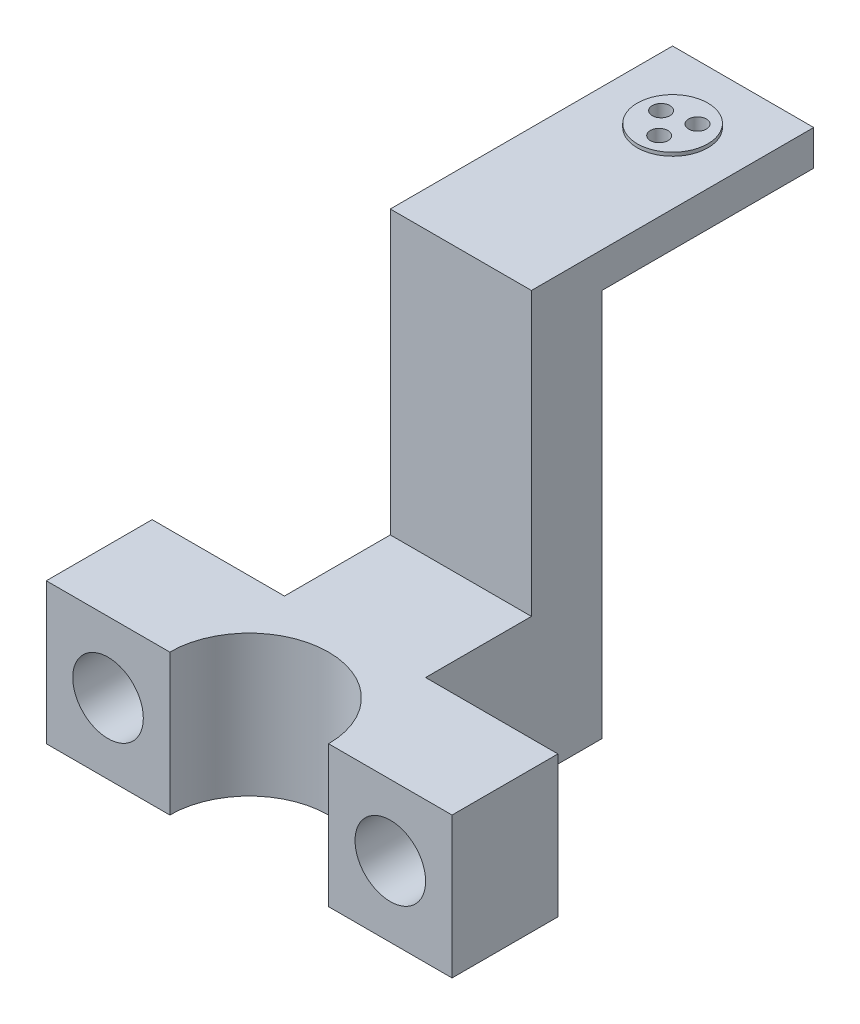
ISO-10303-21;
HEADER;
FILE_DESCRIPTION(('STEP AP214'),'2;1');
FILE_NAME('part.step','',(''),(''),'','','');
FILE_SCHEMA(('AUTOMOTIVE_DESIGN { 1 0 10303 214 1 1 1 1 }'));
ENDSEC;
DATA;
#1=APPLICATION_CONTEXT('core data for automotive mechanical design processes');
#2=APPLICATION_PROTOCOL_DEFINITION('international standard','automotive_design',2000,#1);
#3=PRODUCT_CONTEXT('',#1,'mechanical');
#4=PRODUCT('Part','Part','',(#3));
#5=PRODUCT_RELATED_PRODUCT_CATEGORY('part','',(#4));
#6=PRODUCT_DEFINITION_FORMATION('','',#4);
#7=PRODUCT_DEFINITION_CONTEXT('part definition',#1,'design');
#8=PRODUCT_DEFINITION('design','',#6,#7);
#9=PRODUCT_DEFINITION_SHAPE('','',#8);
#10=(LENGTH_UNIT() NAMED_UNIT(*) SI_UNIT(.MILLI.,.METRE.));
#11=(NAMED_UNIT(*) PLANE_ANGLE_UNIT() SI_UNIT($,.RADIAN.));
#12=(NAMED_UNIT(*) SI_UNIT($,.STERADIAN.) SOLID_ANGLE_UNIT());
#13=UNCERTAINTY_MEASURE_WITH_UNIT(LENGTH_MEASURE(1.E-05),#10,'distance_accuracy_value','');
#14=(GEOMETRIC_REPRESENTATION_CONTEXT(3) GLOBAL_UNCERTAINTY_ASSIGNED_CONTEXT((#13)) GLOBAL_UNIT_ASSIGNED_CONTEXT((#10,
#11,#12)) REPRESENTATION_CONTEXT('',''));
#15=CARTESIAN_POINT('',(0.,0.,0.));
#16=DIRECTION('',(0.,0.,1.));
#17=DIRECTION('',(1.,0.,0.));
#18=AXIS2_PLACEMENT_3D('',#15,#16,#17);
#19=CARTESIAN_POINT('',(-59.6296296296296,43.505291005291,60.));
#20=DIRECTION('',(0.,-1.,0.));
#21=DIRECTION('',(0.,0.,-1.));
#22=AXIS2_PLACEMENT_3D('',#19,#20,#21);
#23=PLANE('',#22);
#24=DIRECTION('',(1.,0.,0.));
#25=VECTOR('',#24,1.);
#26=CARTESIAN_POINT('',(-22.1296296296296,43.505291005291,-30.));
#27=LINE('',#26,#25);
#28=CARTESIAN_POINT('',(-22.1296296296296,43.505291005291,-30.));
#29=VERTEX_POINT('',#28);
#30=CARTESIAN_POINT('',(17.8703703703704,43.505291005291,-30.));
#31=VERTEX_POINT('',#30);
#32=EDGE_CURVE('E57',#29,#31,#27,.T.);
#33=ORIENTED_EDGE('',*,*,#32,.F.);
#34=DIRECTION('',(0.,0.,1.));
#35=VECTOR('',#34,1.);
#36=CARTESIAN_POINT('',(-22.1296296296296,43.505291005291,-50.));
#37=LINE('',#36,#35);
#38=CARTESIAN_POINT('',(-22.1296296296296,43.505291005291,0.));
#39=VERTEX_POINT('',#38);
#40=EDGE_CURVE('E151',#29,#39,#37,.T.);
#41=ORIENTED_EDGE('',*,*,#40,.T.);
#42=DIRECTION('',(-1.,0.,0.));
#43=VECTOR('',#42,1.);
#44=CARTESIAN_POINT('',(-59.6296296296296,43.505291005291,0.));
#45=LINE('',#44,#43);
#46=CARTESIAN_POINT('',(-59.6296296296296,43.505291005291,0.));
#47=VERTEX_POINT('',#46);
#48=EDGE_CURVE('E258',#39,#47,#45,.T.);
#49=ORIENTED_EDGE('',*,*,#48,.T.);
#50=DIRECTION('',(0.,0.,-1.));
#51=VECTOR('',#50,1.);
#52=CARTESIAN_POINT('',(-59.6296296296296,43.505291005291,60.));
#53=LINE('',#52,#51);
#54=CARTESIAN_POINT('',(-59.6296296296296,43.505291005291,30.));
#55=VERTEX_POINT('',#54);
#56=EDGE_CURVE('E262',#55,#47,#53,.T.);
#57=ORIENTED_EDGE('',*,*,#56,.F.);
#58=DIRECTION('',(-1.,0.,0.));
#59=VECTOR('',#58,1.);
#60=CARTESIAN_POINT('',(-59.6296296296296,43.505291005291,30.));
#61=LINE('',#60,#59);
#62=CARTESIAN_POINT('',(-24.6296296296296,43.505291005291,30.));
#63=VERTEX_POINT('',#62);
#64=EDGE_CURVE('E229',#63,#55,#61,.T.);
#65=ORIENTED_EDGE('',*,*,#64,.F.);
#66=CARTESIAN_POINT('',(-2.12962962962962,43.505291005291,30.));
#67=DIRECTION('',(0.,1.,0.));
#68=DIRECTION('',(0.,0.,1.));
#69=AXIS2_PLACEMENT_3D('',#66,#67,#68);
#70=CIRCLE('',#69,22.5);
#71=CARTESIAN_POINT('',(20.3703703703704,43.505291005291,30.));
#72=VERTEX_POINT('',#71);
#73=EDGE_CURVE('E226',#72,#63,#70,.T.);
#74=ORIENTED_EDGE('',*,*,#73,.F.);
#75=DIRECTION('',(-1.,0.,0.));
#76=VECTOR('',#75,1.);
#77=CARTESIAN_POINT('',(20.3703703703704,43.505291005291,30.));
#78=LINE('',#77,#76);
#79=CARTESIAN_POINT('',(55.3703703703704,43.505291005291,30.));
#80=VERTEX_POINT('',#79);
#81=EDGE_CURVE('E223',#80,#72,#78,.T.);
#82=ORIENTED_EDGE('',*,*,#81,.F.);
#83=DIRECTION('',(0.,0.,-1.));
#84=VECTOR('',#83,1.);
#85=CARTESIAN_POINT('',(55.3703703703704,43.505291005291,60.));
#86=LINE('',#85,#84);
#87=CARTESIAN_POINT('',(55.3703703703704,43.505291005291,0.));
#88=VERTEX_POINT('',#87);
#89=EDGE_CURVE('E265',#80,#88,#86,.T.);
#90=ORIENTED_EDGE('',*,*,#89,.T.);
#91=CARTESIAN_POINT('',(17.8703703703704,43.505291005291,0.));
#92=VERTEX_POINT('',#91);
#93=EDGE_CURVE('E259',#88,#92,#45,.T.);
#94=ORIENTED_EDGE('',*,*,#93,.T.);
#95=DIRECTION('',(0.,0.,1.));
#96=VECTOR('',#95,1.);
#97=CARTESIAN_POINT('',(17.8703703703704,43.505291005291,-50.));
#98=LINE('',#97,#96);
#99=EDGE_CURVE('E200',#31,#92,#98,.T.);
#100=ORIENTED_EDGE('',*,*,#99,.F.);
#101=EDGE_LOOP('',(#33,#41,#49,#57,#65,#74,#82,#90,#94,#100));
#102=FACE_BOUND('',#101,.T.);
#103=ADVANCED_FACE('F42',(#102),#23,.F.);
#104=CARTESIAN_POINT('',(0.,0.,0.));
#105=DIRECTION('',(0.,0.,1.));
#106=DIRECTION('',(1.,0.,0.));
#107=AXIS2_PLACEMENT_3D('',#104,#105,#106);
#108=PLANE('',#107);
#109=CARTESIAN_POINT('',(37.8703703703704,23.505291005291,0.));
#110=DIRECTION('',(0.,0.,1.));
#111=DIRECTION('',(1.,0.,0.));
#112=AXIS2_PLACEMENT_3D('',#109,#110,#111);
#113=CIRCLE('',#112,10.);
#114=CARTESIAN_POINT('',(47.8703703703704,23.505291005291,0.));
#115=VERTEX_POINT('',#114);
#116=EDGE_CURVE('E215',#115,#115,#113,.T.);
#117=ORIENTED_EDGE('',*,*,#116,.T.);
#118=EDGE_LOOP('',(#117));
#119=FACE_BOUND('',#118,.T.);
#120=DIRECTION('',(0.,-1.,0.));
#121=VECTOR('',#120,1.);
#122=CARTESIAN_POINT('',(17.8703703703704,43.505291005291,0.));
#123=LINE('',#122,#121);
#124=CARTESIAN_POINT('',(17.8703703703704,3.50529100529105,0.));
#125=VERTEX_POINT('',#124);
#126=EDGE_CURVE('E153',#92,#125,#123,.T.);
#127=ORIENTED_EDGE('',*,*,#126,.F.);
#128=ORIENTED_EDGE('',*,*,#93,.F.);
#129=DIRECTION('',(0.,1.,0.));
#130=VECTOR('',#129,1.);
#131=CARTESIAN_POINT('',(55.3703703703704,43.505291005291,0.));
#132=LINE('',#131,#130);
#133=CARTESIAN_POINT('',(55.3703703703704,3.50529100529105,0.));
#134=VERTEX_POINT('',#133);
#135=EDGE_CURVE('E255',#134,#88,#132,.T.);
#136=ORIENTED_EDGE('',*,*,#135,.F.);
#137=DIRECTION('',(1.,0.,0.));
#138=VECTOR('',#137,1.);
#139=CARTESIAN_POINT('',(-59.6296296296296,3.50529100529105,0.));
#140=LINE('',#139,#138);
#141=EDGE_CURVE('E65',#125,#134,#140,.T.);
#142=ORIENTED_EDGE('',*,*,#141,.F.);
#143=EDGE_LOOP('',(#127,#128,#136,#142));
#144=FACE_BOUND('',#143,.T.);
#145=ADVANCED_FACE('F291',(#119,#144),#108,.F.);
#146=CARTESIAN_POINT('',(-42.1296296296296,23.505291005291,0.));
#147=DIRECTION('',(0.,0.,1.));
#148=DIRECTION('',(1.,0.,0.));
#149=AXIS2_PLACEMENT_3D('',#146,#147,#148);
#150=CIRCLE('',#149,10.);
#151=CARTESIAN_POINT('',(-32.1296296296296,23.505291005291,0.));
#152=VERTEX_POINT('',#151);
#153=EDGE_CURVE('E220',#152,#152,#150,.T.);
#154=ORIENTED_EDGE('',*,*,#153,.T.);
#155=EDGE_LOOP('',(#154));
#156=FACE_BOUND('',#155,.T.);
#157=DIRECTION('',(0.,1.,0.));
#158=VECTOR('',#157,1.);
#159=CARTESIAN_POINT('',(-22.1296296296296,43.505291005291,0.));
#160=LINE('',#159,#158);
#161=CARTESIAN_POINT('',(-22.1296296296296,3.50529100529105,0.));
#162=VERTEX_POINT('',#161);
#163=EDGE_CURVE('E196',#162,#39,#160,.T.);
#164=ORIENTED_EDGE('',*,*,#163,.F.);
#165=CARTESIAN_POINT('',(-59.6296296296296,3.50529100529105,0.));
#166=VERTEX_POINT('',#165);
#167=EDGE_CURVE('E252',#166,#162,#140,.T.);
#168=ORIENTED_EDGE('',*,*,#167,.F.);
#169=DIRECTION('',(0.,-1.,0.));
#170=VECTOR('',#169,1.);
#171=CARTESIAN_POINT('',(-59.6296296296296,43.505291005291,0.));
#172=LINE('',#171,#170);
#173=EDGE_CURVE('E249',#47,#166,#172,.T.);
#174=ORIENTED_EDGE('',*,*,#173,.F.);
#175=ORIENTED_EDGE('',*,*,#48,.F.);
#176=EDGE_LOOP('',(#164,#168,#174,#175));
#177=FACE_BOUND('',#176,.T.);
#178=ADVANCED_FACE('F277',(#156,#177),#108,.F.);
#179=CARTESIAN_POINT('',(-59.6296296296296,43.505291005291,60.));
#180=DIRECTION('',(1.,0.,0.));
#181=DIRECTION('',(0.,0.,-1.));
#182=AXIS2_PLACEMENT_3D('',#179,#180,#181);
#183=PLANE('',#182);
#184=DIRECTION('',(0.,0.,-1.));
#185=VECTOR('',#184,1.);
#186=CARTESIAN_POINT('',(-59.6296296296296,3.50529100529105,60.));
#187=LINE('',#186,#185);
#188=CARTESIAN_POINT('',(-59.6296296296296,3.50529100529105,30.));
#189=VERTEX_POINT('',#188);
#190=EDGE_CURVE('E50',#189,#166,#187,.T.);
#191=ORIENTED_EDGE('',*,*,#190,.F.);
#192=DIRECTION('',(0.,1.,0.));
#193=VECTOR('',#192,1.);
#194=CARTESIAN_POINT('',(-59.6296296296296,-16.494708994709,30.));
#195=LINE('',#194,#193);
#196=EDGE_CURVE('E232',#189,#55,#195,.T.);
#197=ORIENTED_EDGE('',*,*,#196,.T.);
#198=ORIENTED_EDGE('',*,*,#56,.T.);
#199=ORIENTED_EDGE('',*,*,#173,.T.);
#200=EDGE_LOOP('',(#191,#197,#198,#199));
#201=FACE_BOUND('',#200,.T.);
#202=ADVANCED_FACE('F44',(#201),#183,.F.);
#203=CARTESIAN_POINT('',(-59.6296296296296,3.50529100529105,60.));
#204=DIRECTION('',(0.,1.,0.));
#205=DIRECTION('',(0.,0.,1.));
#206=AXIS2_PLACEMENT_3D('',#203,#204,#205);
#207=PLANE('',#206);
#208=CARTESIAN_POINT('',(-2.12962962962962,3.50529100529105,30.));
#209=DIRECTION('',(0.,1.,0.));
#210=DIRECTION('',(0.,0.,1.));
#211=AXIS2_PLACEMENT_3D('',#208,#209,#210);
#212=CIRCLE('',#211,22.5);
#213=CARTESIAN_POINT('',(20.3703703703704,3.50529100529105,30.));
#214=VERTEX_POINT('',#213);
#215=CARTESIAN_POINT('',(-24.6296296296296,3.50529100529105,30.));
#216=VERTEX_POINT('',#215);
#217=EDGE_CURVE('E243',#214,#216,#212,.T.);
#218=ORIENTED_EDGE('',*,*,#217,.T.);
#219=DIRECTION('',(-1.,0.,0.));
#220=VECTOR('',#219,1.);
#221=CARTESIAN_POINT('',(-59.6296296296296,3.50529100529105,30.));
#222=LINE('',#221,#220);
#223=EDGE_CURVE('E246',#216,#189,#222,.T.);
#224=ORIENTED_EDGE('',*,*,#223,.T.);
#225=ORIENTED_EDGE('',*,*,#190,.T.);
#226=ORIENTED_EDGE('',*,*,#167,.T.);
#227=DIRECTION('',(0.,0.,1.));
#228=VECTOR('',#227,1.);
#229=CARTESIAN_POINT('',(-22.1296296296296,3.50529100529105,-50.));
#230=LINE('',#229,#228);
#231=CARTESIAN_POINT('',(-22.1296296296296,3.50529100529105,-50.));
#232=VERTEX_POINT('',#231);
#233=EDGE_CURVE('E206',#232,#162,#230,.T.);
#234=ORIENTED_EDGE('',*,*,#233,.F.);
#235=DIRECTION('',(-1.,0.,0.));
#236=VECTOR('',#235,1.);
#237=CARTESIAN_POINT('',(17.8703703703704,3.50529100529105,-50.));
#238=LINE('',#237,#236);
#239=CARTESIAN_POINT('',(17.8703703703704,3.50529100529105,-50.));
#240=VERTEX_POINT('',#239);
#241=EDGE_CURVE('E195',#240,#232,#238,.T.);
#242=ORIENTED_EDGE('',*,*,#241,.F.);
#243=DIRECTION('',(0.,0.,1.));
#244=VECTOR('',#243,1.);
#245=CARTESIAN_POINT('',(17.8703703703704,3.50529100529105,-50.));
#246=LINE('',#245,#244);
#247=EDGE_CURVE('E209',#240,#125,#246,.T.);
#248=ORIENTED_EDGE('',*,*,#247,.T.);
#249=ORIENTED_EDGE('',*,*,#141,.T.);
#250=DIRECTION('',(0.,0.,-1.));
#251=VECTOR('',#250,1.);
#252=CARTESIAN_POINT('',(55.3703703703704,3.50529100529105,60.));
#253=LINE('',#252,#251);
#254=CARTESIAN_POINT('',(55.3703703703704,3.50529100529105,30.));
#255=VERTEX_POINT('',#254);
#256=EDGE_CURVE('E267',#255,#134,#253,.T.);
#257=ORIENTED_EDGE('',*,*,#256,.F.);
#258=DIRECTION('',(-1.,0.,0.));
#259=VECTOR('',#258,1.);
#260=CARTESIAN_POINT('',(-59.6296296296296,3.50529100529105,30.));
#261=LINE('',#260,#259);
#262=EDGE_CURVE('E235',#255,#214,#261,.T.);
#263=ORIENTED_EDGE('',*,*,#262,.T.);
#264=EDGE_LOOP('',(#218,#224,#225,#226,#234,#242,#248,#249,#257,#263));
#265=FACE_BOUND('',#264,.T.);
#266=ADVANCED_FACE('F272',(#265),#207,.F.);
#267=CARTESIAN_POINT('',(55.3703703703704,43.505291005291,60.));
#268=DIRECTION('',(-1.,0.,0.));
#269=DIRECTION('',(0.,-1.,0.));
#270=AXIS2_PLACEMENT_3D('',#267,#268,#269);
#271=PLANE('',#270);
#272=ORIENTED_EDGE('',*,*,#89,.F.);
#273=DIRECTION('',(0.,1.,0.));
#274=VECTOR('',#273,1.);
#275=CARTESIAN_POINT('',(55.3703703703704,-16.494708994709,30.));
#276=LINE('',#275,#274);
#277=EDGE_CURVE('E231',#255,#80,#276,.T.);
#278=ORIENTED_EDGE('',*,*,#277,.F.);
#279=ORIENTED_EDGE('',*,*,#256,.T.);
#280=ORIENTED_EDGE('',*,*,#135,.T.);
#281=EDGE_LOOP('',(#272,#278,#279,#280));
#282=FACE_BOUND('',#281,.T.);
#283=ADVANCED_FACE('F296',(#282),#271,.F.);
#284=CARTESIAN_POINT('',(-59.6296296296296,-16.494708994709,30.));
#285=DIRECTION('',(0.,0.,-1.));
#286=DIRECTION('',(-1.,0.,0.));
#287=AXIS2_PLACEMENT_3D('',#284,#285,#286);
#288=PLANE('',#287);
#289=CARTESIAN_POINT('',(-42.1296296296296,23.505291005291,30.));
#290=DIRECTION('',(0.,0.,1.));
#291=DIRECTION('',(1.,0.,0.));
#292=AXIS2_PLACEMENT_3D('',#289,#290,#291);
#293=CIRCLE('',#292,10.);
#294=CARTESIAN_POINT('',(-32.1296296296296,23.505291005291,30.));
#295=VERTEX_POINT('',#294);
#296=EDGE_CURVE('E212',#295,#295,#293,.T.);
#297=ORIENTED_EDGE('',*,*,#296,.F.);
#298=EDGE_LOOP('',(#297));
#299=FACE_BOUND('',#298,.T.);
#300=DIRECTION('',(0.,1.,0.));
#301=VECTOR('',#300,1.);
#302=CARTESIAN_POINT('',(-24.6296296296296,-16.494708994709,30.));
#303=LINE('',#302,#301);
#304=EDGE_CURVE('E236',#216,#63,#303,.T.);
#305=ORIENTED_EDGE('',*,*,#304,.T.);
#306=ORIENTED_EDGE('',*,*,#64,.T.);
#307=ORIENTED_EDGE('',*,*,#196,.F.);
#308=ORIENTED_EDGE('',*,*,#223,.F.);
#309=EDGE_LOOP('',(#305,#306,#307,#308));
#310=FACE_BOUND('',#309,.T.);
#311=ADVANCED_FACE('F305',(#299,#310),#288,.F.);
#312=CARTESIAN_POINT('',(-2.12962962962962,-16.494708994709,30.));
#313=DIRECTION('',(0.,1.,0.));
#314=DIRECTION('',(0.,0.,1.));
#315=AXIS2_PLACEMENT_3D('',#312,#313,#314);
#316=CYLINDRICAL_SURFACE('',#315,22.5);
#317=DIRECTION('',(0.,1.,0.));
#318=VECTOR('',#317,1.);
#319=CARTESIAN_POINT('',(20.3703703703704,-16.494708994709,30.));
#320=LINE('',#319,#318);
#321=EDGE_CURVE('E238',#214,#72,#320,.T.);
#322=ORIENTED_EDGE('',*,*,#321,.T.);
#323=ORIENTED_EDGE('',*,*,#73,.T.);
#324=ORIENTED_EDGE('',*,*,#304,.F.);
#325=ORIENTED_EDGE('',*,*,#217,.F.);
#326=EDGE_LOOP('',(#322,#323,#324,#325));
#327=FACE_BOUND('',#326,.T.);
#328=ADVANCED_FACE('F302',(#327),#316,.F.);
#329=CARTESIAN_POINT('',(20.3703703703704,-16.494708994709,30.));
#330=DIRECTION('',(0.,0.,-1.));
#331=DIRECTION('',(-1.,0.,0.));
#332=AXIS2_PLACEMENT_3D('',#329,#330,#331);
#333=PLANE('',#332);
#334=CARTESIAN_POINT('',(37.8703703703704,23.505291005291,30.));
#335=DIRECTION('',(0.,0.,1.));
#336=DIRECTION('',(1.,0.,0.));
#337=AXIS2_PLACEMENT_3D('',#334,#335,#336);
#338=CIRCLE('',#337,10.);
#339=CARTESIAN_POINT('',(47.8703703703704,23.505291005291,30.));
#340=VERTEX_POINT('',#339);
#341=EDGE_CURVE('E211',#340,#340,#338,.T.);
#342=ORIENTED_EDGE('',*,*,#341,.F.);
#343=EDGE_LOOP('',(#342));
#344=FACE_BOUND('',#343,.T.);
#345=ORIENTED_EDGE('',*,*,#277,.T.);
#346=ORIENTED_EDGE('',*,*,#81,.T.);
#347=ORIENTED_EDGE('',*,*,#321,.F.);
#348=ORIENTED_EDGE('',*,*,#262,.F.);
#349=EDGE_LOOP('',(#345,#346,#347,#348));
#350=FACE_BOUND('',#349,.T.);
#351=ADVANCED_FACE('F300',(#344,#350),#333,.F.);
#352=CARTESIAN_POINT('',(37.8703703703704,23.505291005291,-30.));
#353=DIRECTION('',(0.,0.,1.));
#354=DIRECTION('',(1.,0.,0.));
#355=AXIS2_PLACEMENT_3D('',#352,#353,#354);
#356=CYLINDRICAL_SURFACE('',#355,10.);
#357=ORIENTED_EDGE('',*,*,#341,.T.);
#358=EDGE_LOOP('',(#357));
#359=FACE_BOUND('',#358,.T.);
#360=ORIENTED_EDGE('',*,*,#116,.F.);
#361=EDGE_LOOP('',(#360));
#362=FACE_BOUND('',#361,.T.);
#363=ADVANCED_FACE('F339',(#359,#362),#356,.F.);
#364=CARTESIAN_POINT('',(-42.1296296296296,23.505291005291,-30.));
#365=DIRECTION('',(0.,0.,1.));
#366=DIRECTION('',(1.,0.,0.));
#367=AXIS2_PLACEMENT_3D('',#364,#365,#366);
#368=CYLINDRICAL_SURFACE('',#367,10.);
#369=ORIENTED_EDGE('',*,*,#296,.T.);
#370=EDGE_LOOP('',(#369));
#371=FACE_BOUND('',#370,.T.);
#372=ORIENTED_EDGE('',*,*,#153,.F.);
#373=EDGE_LOOP('',(#372));
#374=FACE_BOUND('',#373,.T.);
#375=ADVANCED_FACE('F337',(#371,#374),#368,.F.);
#376=CARTESIAN_POINT('',(17.8703703703704,43.505291005291,-50.));
#377=DIRECTION('',(-1.,0.,0.));
#378=DIRECTION('',(0.,-1.,0.));
#379=AXIS2_PLACEMENT_3D('',#376,#377,#378);
#380=PLANE('',#379);
#381=ORIENTED_EDGE('',*,*,#126,.T.);
#382=ORIENTED_EDGE('',*,*,#247,.F.);
#383=DIRECTION('',(0.,-1.,0.));
#384=VECTOR('',#383,1.);
#385=CARTESIAN_POINT('',(17.8703703703704,43.505291005291,-50.));
#386=LINE('',#385,#384);
#387=CARTESIAN_POINT('',(17.8703703703704,113.505291005291,-50.));
#388=VERTEX_POINT('',#387);
#389=EDGE_CURVE('E192',#388,#240,#386,.T.);
#390=ORIENTED_EDGE('',*,*,#389,.F.);
#391=DIRECTION('',(0.,0.,-1.));
#392=VECTOR('',#391,1.);
#393=CARTESIAN_POINT('',(17.8703703703704,113.505291005291,-30.));
#394=LINE('',#393,#392);
#395=CARTESIAN_POINT('',(17.8703703703704,113.505291005291,-110.));
#396=VERTEX_POINT('',#395);
#397=EDGE_CURVE('E170',#388,#396,#394,.T.);
#398=ORIENTED_EDGE('',*,*,#397,.T.);
#399=DIRECTION('',(0.,-1.,0.));
#400=VECTOR('',#399,1.);
#401=CARTESIAN_POINT('',(17.8703703703704,123.505291005291,-110.));
#402=LINE('',#401,#400);
#403=CARTESIAN_POINT('',(17.8703703703704,123.505291005291,-110.));
#404=VERTEX_POINT('',#403);
#405=EDGE_CURVE('E184',#404,#396,#402,.T.);
#406=ORIENTED_EDGE('',*,*,#405,.F.);
#407=DIRECTION('',(0.,0.,-1.));
#408=VECTOR('',#407,1.);
#409=CARTESIAN_POINT('',(17.8703703703704,123.505291005291,-30.));
#410=LINE('',#409,#408);
#411=CARTESIAN_POINT('',(17.8703703703704,123.505291005291,-30.));
#412=VERTEX_POINT('',#411);
#413=EDGE_CURVE('E162',#412,#404,#410,.T.);
#414=ORIENTED_EDGE('',*,*,#413,.F.);
#415=DIRECTION('',(0.,-1.,0.));
#416=VECTOR('',#415,1.);
#417=CARTESIAN_POINT('',(17.8703703703704,113.505291005291,-30.));
#418=LINE('',#417,#416);
#419=EDGE_CURVE('E154',#412,#31,#418,.T.);
#420=ORIENTED_EDGE('',*,*,#419,.T.);
#421=ORIENTED_EDGE('',*,*,#99,.T.);
#422=EDGE_LOOP('',(#381,#382,#390,#398,#406,#414,#420,#421));
#423=FACE_BOUND('',#422,.T.);
#424=ADVANCED_FACE('F289',(#423),#380,.F.);
#425=CARTESIAN_POINT('',(-22.1296296296296,43.505291005291,-50.));
#426=DIRECTION('',(1.,0.,0.));
#427=DIRECTION('',(0.,1.,0.));
#428=AXIS2_PLACEMENT_3D('',#425,#426,#427);
#429=PLANE('',#428);
#430=ORIENTED_EDGE('',*,*,#163,.T.);
#431=ORIENTED_EDGE('',*,*,#40,.F.);
#432=DIRECTION('',(0.,-1.,0.));
#433=VECTOR('',#432,1.);
#434=CARTESIAN_POINT('',(-22.1296296296296,113.505291005291,-30.));
#435=LINE('',#434,#433);
#436=CARTESIAN_POINT('',(-22.1296296296296,123.505291005291,-30.));
#437=VERTEX_POINT('',#436);
#438=EDGE_CURVE('E144',#437,#29,#435,.T.);
#439=ORIENTED_EDGE('',*,*,#438,.F.);
#440=DIRECTION('',(0.,0.,1.));
#441=VECTOR('',#440,1.);
#442=CARTESIAN_POINT('',(-22.1296296296296,123.505291005291,-30.));
#443=LINE('',#442,#441);
#444=CARTESIAN_POINT('',(-22.1296296296296,123.505291005291,-110.));
#445=VERTEX_POINT('',#444);
#446=EDGE_CURVE('E150',#445,#437,#443,.T.);
#447=ORIENTED_EDGE('',*,*,#446,.F.);
#448=DIRECTION('',(0.,-1.,0.));
#449=VECTOR('',#448,1.);
#450=CARTESIAN_POINT('',(-22.1296296296296,123.505291005291,-110.));
#451=LINE('',#450,#449);
#452=CARTESIAN_POINT('',(-22.1296296296296,113.505291005291,-110.));
#453=VERTEX_POINT('',#452);
#454=EDGE_CURVE('E178',#445,#453,#451,.T.);
#455=ORIENTED_EDGE('',*,*,#454,.T.);
#456=DIRECTION('',(0.,0.,1.));
#457=VECTOR('',#456,1.);
#458=CARTESIAN_POINT('',(-22.1296296296296,113.505291005291,-30.));
#459=LINE('',#458,#457);
#460=CARTESIAN_POINT('',(-22.1296296296296,113.505291005291,-50.));
#461=VERTEX_POINT('',#460);
#462=EDGE_CURVE('E179',#453,#461,#459,.T.);
#463=ORIENTED_EDGE('',*,*,#462,.T.);
#464=DIRECTION('',(0.,1.,0.));
#465=VECTOR('',#464,1.);
#466=CARTESIAN_POINT('',(-22.1296296296296,43.505291005291,-50.));
#467=LINE('',#466,#465);
#468=EDGE_CURVE('E198',#232,#461,#467,.T.);
#469=ORIENTED_EDGE('',*,*,#468,.F.);
#470=ORIENTED_EDGE('',*,*,#233,.T.);
#471=EDGE_LOOP('',(#430,#431,#439,#447,#455,#463,#469,#470));
#472=FACE_BOUND('',#471,.T.);
#473=ADVANCED_FACE('F147',(#472),#429,.F.);
#474=CARTESIAN_POINT('',(0.,0.,-50.));
#475=DIRECTION('',(0.,0.,-1.));
#476=DIRECTION('',(-1.,0.,0.));
#477=AXIS2_PLACEMENT_3D('',#474,#475,#476);
#478=PLANE('',#477);
#479=ORIENTED_EDGE('',*,*,#389,.T.);
#480=ORIENTED_EDGE('',*,*,#241,.T.);
#481=ORIENTED_EDGE('',*,*,#468,.T.);
#482=DIRECTION('',(-1.,0.,0.));
#483=VECTOR('',#482,1.);
#484=CARTESIAN_POINT('',(-22.1296296296296,113.505291005291,-50.));
#485=LINE('',#484,#483);
#486=EDGE_CURVE('E187',#388,#461,#485,.T.);
#487=ORIENTED_EDGE('',*,*,#486,.F.);
#488=EDGE_LOOP('',(#479,#480,#481,#487));
#489=FACE_BOUND('',#488,.T.);
#490=ADVANCED_FACE('F286',(#489),#478,.T.);
#491=CARTESIAN_POINT('',(-22.1296296296296,113.505291005291,-30.));
#492=DIRECTION('',(0.,0.,-1.));
#493=DIRECTION('',(-1.,0.,0.));
#494=AXIS2_PLACEMENT_3D('',#491,#492,#493);
#495=PLANE('',#494);
#496=ORIENTED_EDGE('',*,*,#32,.T.);
#497=ORIENTED_EDGE('',*,*,#419,.F.);
#498=DIRECTION('',(1.,0.,0.));
#499=VECTOR('',#498,1.);
#500=CARTESIAN_POINT('',(-22.1296296296296,123.505291005291,-30.));
#501=LINE('',#500,#499);
#502=EDGE_CURVE('E157',#437,#412,#501,.T.);
#503=ORIENTED_EDGE('',*,*,#502,.F.);
#504=ORIENTED_EDGE('',*,*,#438,.T.);
#505=EDGE_LOOP('',(#496,#497,#503,#504));
#506=FACE_BOUND('',#505,.T.);
#507=ADVANCED_FACE('F158',(#506),#495,.F.);
#508=CARTESIAN_POINT('',(-22.1296296296296,123.505291005291,-110.));
#509=DIRECTION('',(0.,0.,1.));
#510=DIRECTION('',(1.,0.,0.));
#511=AXIS2_PLACEMENT_3D('',#508,#509,#510);
#512=PLANE('',#511);
#513=DIRECTION('',(-1.,0.,0.));
#514=VECTOR('',#513,1.);
#515=CARTESIAN_POINT('',(-22.1296296296296,113.505291005291,-110.));
#516=LINE('',#515,#514);
#517=EDGE_CURVE('E168',#396,#453,#516,.T.);
#518=ORIENTED_EDGE('',*,*,#517,.T.);
#519=ORIENTED_EDGE('',*,*,#454,.F.);
#520=DIRECTION('',(-1.,0.,0.));
#521=VECTOR('',#520,1.);
#522=CARTESIAN_POINT('',(-22.1296296296296,123.505291005291,-110.));
#523=LINE('',#522,#521);
#524=EDGE_CURVE('E166',#404,#445,#523,.T.);
#525=ORIENTED_EDGE('',*,*,#524,.F.);
#526=ORIENTED_EDGE('',*,*,#405,.T.);
#527=EDGE_LOOP('',(#518,#519,#525,#526));
#528=FACE_BOUND('',#527,.T.);
#529=ADVANCED_FACE('F355',(#528),#512,.F.);
#530=CARTESIAN_POINT('',(0.,123.505291005291,0.));
#531=DIRECTION('',(0.,-1.,0.));
#532=DIRECTION('',(0.,0.,-1.));
#533=AXIS2_PLACEMENT_3D('',#530,#531,#532);
#534=PLANE('',#533);
#535=CARTESIAN_POINT('',(-2.12962962962962,123.505291005291,-90.));
#536=DIRECTION('',(0.,-1.,0.));
#537=DIRECTION('',(0.,0.,-1.));
#538=AXIS2_PLACEMENT_3D('',#535,#536,#537);
#539=CIRCLE('',#538,10.);
#540=CARTESIAN_POINT('',(-2.12962962962962,123.505291005291,-100.));
#541=VERTEX_POINT('',#540);
#542=EDGE_CURVE('E11',#541,#541,#539,.F.);
#543=ORIENTED_EDGE('',*,*,#542,.F.);
#544=EDGE_LOOP('',(#543));
#545=FACE_BOUND('',#544,.T.);
#546=ORIENTED_EDGE('',*,*,#446,.T.);
#547=ORIENTED_EDGE('',*,*,#502,.T.);
#548=ORIENTED_EDGE('',*,*,#413,.T.);
#549=ORIENTED_EDGE('',*,*,#524,.T.);
#550=EDGE_LOOP('',(#546,#547,#548,#549));
#551=FACE_BOUND('',#550,.T.);
#552=ADVANCED_FACE('F164',(#545,#551),#534,.F.);
#553=CARTESIAN_POINT('',(0.,113.505291005291,0.));
#554=DIRECTION('',(0.,-1.,0.));
#555=DIRECTION('',(0.,0.,-1.));
#556=AXIS2_PLACEMENT_3D('',#553,#554,#555);
#557=PLANE('',#556);
#558=CARTESIAN_POINT('',(-6.89694042919915,113.505291005291,-91.507563511202));
#559=DIRECTION('',(0.,-1.,0.));
#560=DIRECTION('',(0.,0.,-1.));
#561=AXIS2_PLACEMENT_3D('',#558,#559,#560);
#562=CIRCLE('',#561,2.5);
#563=CARTESIAN_POINT('',(-6.89694042919915,113.505291005291,-94.007563511202));
#564=VERTEX_POINT('',#563);
#565=EDGE_CURVE('E390',#564,#564,#562,.T.);
#566=ORIENTED_EDGE('',*,*,#565,.F.);
#567=EDGE_LOOP('',(#566));
#568=FACE_BOUND('',#567,.T.);
#569=CARTESIAN_POINT('',(1.55961406867454,113.505291005291,-93.3748305045621));
#570=DIRECTION('',(0.,-1.,0.));
#571=DIRECTION('',(0.,0.,-1.));
#572=AXIS2_PLACEMENT_3D('',#569,#570,#571);
#573=CIRCLE('',#572,2.5);
#574=CARTESIAN_POINT('',(1.55961406867454,113.505291005291,-95.8748305045621));
#575=VERTEX_POINT('',#574);
#576=EDGE_CURVE('E398',#575,#575,#573,.T.);
#577=ORIENTED_EDGE('',*,*,#576,.F.);
#578=EDGE_LOOP('',(#577));
#579=FACE_BOUND('',#578,.T.);
#580=CARTESIAN_POINT('',(-1.0515625283643,113.505291005291,-85.1176059842359));
#581=DIRECTION('',(0.,-1.,0.));
#582=DIRECTION('',(0.,0.,-1.));
#583=AXIS2_PLACEMENT_3D('',#580,#581,#582);
#584=CIRCLE('',#583,2.5);
#585=CARTESIAN_POINT('',(-1.0515625283643,113.505291005291,-87.6176059842359));
#586=VERTEX_POINT('',#585);
#587=EDGE_CURVE('E394',#586,#586,#584,.T.);
#588=ORIENTED_EDGE('',*,*,#587,.F.);
#589=EDGE_LOOP('',(#588));
#590=FACE_BOUND('',#589,.T.);
#591=ORIENTED_EDGE('',*,*,#397,.F.);
#592=ORIENTED_EDGE('',*,*,#486,.T.);
#593=ORIENTED_EDGE('',*,*,#462,.F.);
#594=ORIENTED_EDGE('',*,*,#517,.F.);
#595=EDGE_LOOP('',(#591,#592,#593,#594));
#596=FACE_BOUND('',#595,.T.);
#597=ADVANCED_FACE('F359',(#568,#579,#590,#596),#557,.T.);
#598=CARTESIAN_POINT('',(-2.12962962962962,124.505291005291,-90.));
#599=DIRECTION('',(0.,-1.,0.));
#600=DIRECTION('',(0.,0.,-1.));
#601=AXIS2_PLACEMENT_3D('',#598,#599,#600);
#602=CYLINDRICAL_SURFACE('',#601,10.);
#603=CARTESIAN_POINT('',(-2.12962962962962,124.505291005291,-90.));
#604=DIRECTION('',(0.,1.,0.));
#605=DIRECTION('',(0.,0.,1.));
#606=AXIS2_PLACEMENT_3D('',#603,#604,#605);
#607=CIRCLE('',#606,10.);
#608=CARTESIAN_POINT('',(-2.12962962962962,124.505291005291,-80.));
#609=VERTEX_POINT('',#608);
#610=EDGE_CURVE('E173',#609,#609,#607,.T.);
#611=ORIENTED_EDGE('',*,*,#610,.F.);
#612=EDGE_LOOP('',(#611));
#613=FACE_BOUND('',#612,.T.);
#614=ORIENTED_EDGE('',*,*,#542,.T.);
#615=EDGE_LOOP('',(#614));
#616=FACE_BOUND('',#615,.T.);
#617=ADVANCED_FACE('F362',(#613,#616),#602,.T.);
#618=CARTESIAN_POINT('',(-2.12962962962962,124.505291005291,-90.));
#619=DIRECTION('',(0.,1.,0.));
#620=DIRECTION('',(0.,0.,1.));
#621=AXIS2_PLACEMENT_3D('',#618,#619,#620);
#622=PLANE('',#621);
#623=CARTESIAN_POINT('',(-6.89694042919915,124.505291005291,-91.507563511202));
#624=DIRECTION('',(0.,1.,0.));
#625=DIRECTION('',(0.,0.,1.));
#626=AXIS2_PLACEMENT_3D('',#623,#624,#625);
#627=CIRCLE('',#626,2.5);
#628=CARTESIAN_POINT('',(-6.89694042919915,124.505291005291,-89.007563511202));
#629=VERTEX_POINT('',#628);
#630=EDGE_CURVE('E393',#629,#629,#627,.T.);
#631=ORIENTED_EDGE('',*,*,#630,.F.);
#632=EDGE_LOOP('',(#631));
#633=FACE_BOUND('',#632,.T.);
#634=CARTESIAN_POINT('',(1.55961406867454,124.505291005291,-93.3748305045621));
#635=DIRECTION('',(0.,1.,0.));
#636=DIRECTION('',(0.,0.,1.));
#637=AXIS2_PLACEMENT_3D('',#634,#635,#636);
#638=CIRCLE('',#637,2.5);
#639=CARTESIAN_POINT('',(1.55961406867454,124.505291005291,-90.8748305045621));
#640=VERTEX_POINT('',#639);
#641=EDGE_CURVE('E395',#640,#640,#638,.T.);
#642=ORIENTED_EDGE('',*,*,#641,.F.);
#643=EDGE_LOOP('',(#642));
#644=FACE_BOUND('',#643,.T.);
#645=CARTESIAN_POINT('',(-1.0515625283643,124.505291005291,-85.1176059842359));
#646=DIRECTION('',(0.,1.,0.));
#647=DIRECTION('',(0.,0.,1.));
#648=AXIS2_PLACEMENT_3D('',#645,#646,#647);
#649=CIRCLE('',#648,2.5);
#650=CARTESIAN_POINT('',(-1.0515625283643,124.505291005291,-82.6176059842359));
#651=VERTEX_POINT('',#650);
#652=EDGE_CURVE('E401',#651,#651,#649,.T.);
#653=ORIENTED_EDGE('',*,*,#652,.F.);
#654=EDGE_LOOP('',(#653));
#655=FACE_BOUND('',#654,.T.);
#656=ORIENTED_EDGE('',*,*,#610,.T.);
#657=EDGE_LOOP('',(#656));
#658=FACE_BOUND('',#657,.T.);
#659=ADVANCED_FACE('F369',(#633,#644,#655,#658),#622,.T.);
#660=CARTESIAN_POINT('',(-1.0515625283643,109.505291005291,-85.1176059842359));
#661=DIRECTION('',(0.,1.,0.));
#662=DIRECTION('',(0.,0.,1.));
#663=AXIS2_PLACEMENT_3D('',#660,#661,#662);
#664=CYLINDRICAL_SURFACE('',#663,2.5);
#665=ORIENTED_EDGE('',*,*,#587,.T.);
#666=EDGE_LOOP('',(#665));
#667=FACE_BOUND('',#666,.T.);
#668=ORIENTED_EDGE('',*,*,#652,.T.);
#669=EDGE_LOOP('',(#668));
#670=FACE_BOUND('',#669,.T.);
#671=ADVANCED_FACE('F373',(#667,#670),#664,.F.);
#672=CARTESIAN_POINT('',(1.55961406867454,109.505291005291,-93.3748305045621));
#673=DIRECTION('',(0.,1.,0.));
#674=DIRECTION('',(0.,0.,1.));
#675=AXIS2_PLACEMENT_3D('',#672,#673,#674);
#676=CYLINDRICAL_SURFACE('',#675,2.5);
#677=ORIENTED_EDGE('',*,*,#576,.T.);
#678=EDGE_LOOP('',(#677));
#679=FACE_BOUND('',#678,.T.);
#680=ORIENTED_EDGE('',*,*,#641,.T.);
#681=EDGE_LOOP('',(#680));
#682=FACE_BOUND('',#681,.T.);
#683=ADVANCED_FACE('F377',(#679,#682),#676,.F.);
#684=CARTESIAN_POINT('',(-6.89694042919915,109.505291005291,-91.507563511202));
#685=DIRECTION('',(0.,1.,0.));
#686=DIRECTION('',(0.,0.,1.));
#687=AXIS2_PLACEMENT_3D('',#684,#685,#686);
#688=CYLINDRICAL_SURFACE('',#687,2.5);
#689=ORIENTED_EDGE('',*,*,#565,.T.);
#690=EDGE_LOOP('',(#689));
#691=FACE_BOUND('',#690,.T.);
#692=ORIENTED_EDGE('',*,*,#630,.T.);
#693=EDGE_LOOP('',(#692));
#694=FACE_BOUND('',#693,.T.);
#695=ADVANCED_FACE('F381',(#691,#694),#688,.F.);
#696=CLOSED_SHELL('',(#103,#145,#178,#202,#266,#283,#311,#328,#351,#363,#375,#424,#473,#490,
#507,#529,#552,#597,#617,#659,#671,#683,#695));
#697=MANIFOLD_SOLID_BREP('B2',#696);
#698=ADVANCED_BREP_SHAPE_REPRESENTATION('',(#18,#697),#14);
#699=SHAPE_DEFINITION_REPRESENTATION(#9,#698);
ENDSEC;
END-ISO-10303-21;
